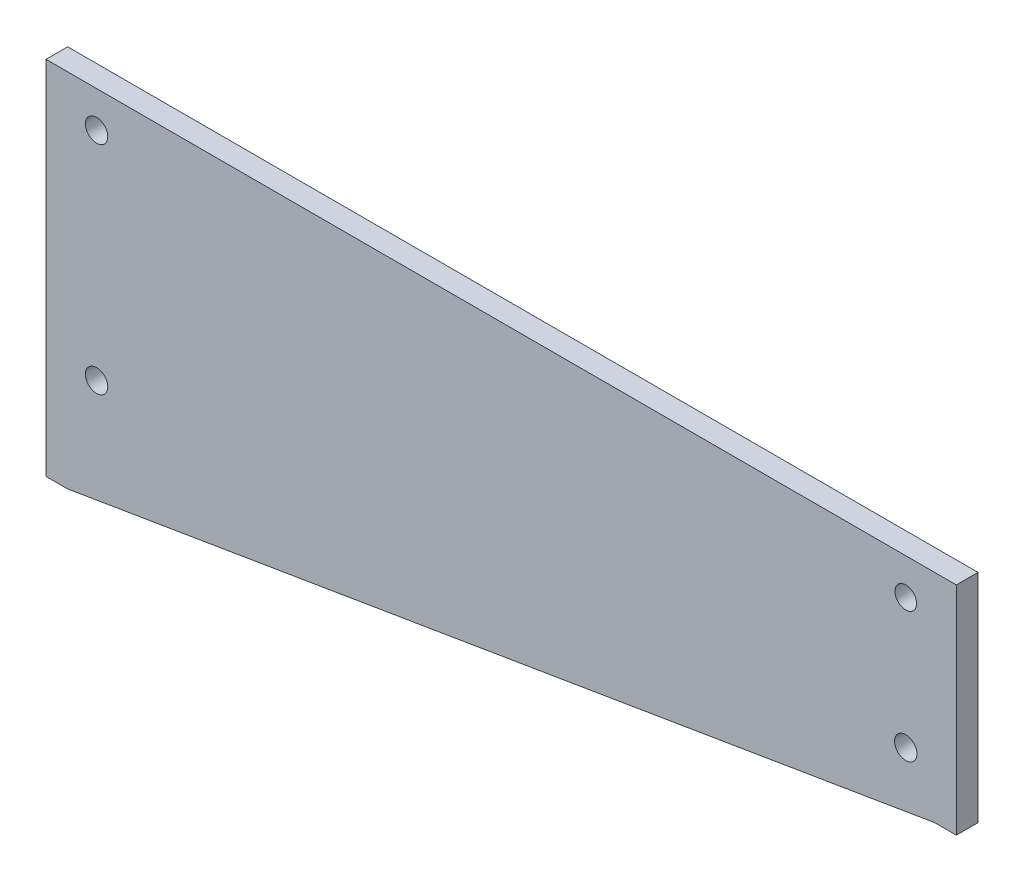
ISO-10303-21;
HEADER;
FILE_DESCRIPTION(('STEP AP214'),'2;1');
FILE_NAME('part.step','',(''),(''),'','','');
FILE_SCHEMA(('AUTOMOTIVE_DESIGN { 1 0 10303 214 1 1 1 1 }'));
ENDSEC;
DATA;
#1=APPLICATION_CONTEXT('core data for automotive mechanical design processes');
#2=APPLICATION_PROTOCOL_DEFINITION('international standard','automotive_design',2000,#1);
#3=PRODUCT_CONTEXT('',#1,'mechanical');
#4=PRODUCT('Part','Part','',(#3));
#5=PRODUCT_RELATED_PRODUCT_CATEGORY('part','',(#4));
#6=PRODUCT_DEFINITION_FORMATION('','',#4);
#7=PRODUCT_DEFINITION_CONTEXT('part definition',#1,'design');
#8=PRODUCT_DEFINITION('design','',#6,#7);
#9=PRODUCT_DEFINITION_SHAPE('','',#8);
#10=(LENGTH_UNIT() NAMED_UNIT(*) SI_UNIT(.MILLI.,.METRE.));
#11=(NAMED_UNIT(*) PLANE_ANGLE_UNIT() SI_UNIT($,.RADIAN.));
#12=(NAMED_UNIT(*) SI_UNIT($,.STERADIAN.) SOLID_ANGLE_UNIT());
#13=UNCERTAINTY_MEASURE_WITH_UNIT(LENGTH_MEASURE(1.E-05),#10,'distance_accuracy_value','');
#14=(GEOMETRIC_REPRESENTATION_CONTEXT(3) GLOBAL_UNCERTAINTY_ASSIGNED_CONTEXT((#13)) GLOBAL_UNIT_ASSIGNED_CONTEXT((#10,
#11,#12)) REPRESENTATION_CONTEXT('',''));
#15=CARTESIAN_POINT('',(0.,0.,0.));
#16=DIRECTION('',(0.,0.,1.));
#17=DIRECTION('',(1.,0.,0.));
#18=AXIS2_PLACEMENT_3D('',#15,#16,#17);
#19=CARTESIAN_POINT('',(-63.,-26.5,3.));
#20=DIRECTION('',(1.,0.,0.));
#21=DIRECTION('',(0.,0.,-1.));
#22=AXIS2_PLACEMENT_3D('',#19,#20,#21);
#23=PLANE('',#22);
#24=DIRECTION('',(0.,-1.,0.));
#25=VECTOR('',#24,1.);
#26=CARTESIAN_POINT('',(-63.,-26.5,0.));
#27=LINE('',#26,#25);
#28=CARTESIAN_POINT('',(-63.,26.5,0.));
#29=VERTEX_POINT('',#28);
#30=CARTESIAN_POINT('',(-63.,-23.5000000000002,0.));
#31=VERTEX_POINT('',#30);
#32=EDGE_CURVE('E94',#29,#31,#27,.T.);
#33=ORIENTED_EDGE('',*,*,#32,.T.);
#34=DIRECTION('',(0.,0.,1.));
#35=VECTOR('',#34,1.);
#36=CARTESIAN_POINT('',(-63.,-23.5000000000002,0.));
#37=LINE('',#36,#35);
#38=CARTESIAN_POINT('',(-63.,-23.5000000000002,3.));
#39=VERTEX_POINT('',#38);
#40=EDGE_CURVE('E167',#31,#39,#37,.T.);
#41=ORIENTED_EDGE('',*,*,#40,.T.);
#42=DIRECTION('',(0.,-1.,0.));
#43=VECTOR('',#42,1.);
#44=CARTESIAN_POINT('',(-63.,-26.5,3.));
#45=LINE('',#44,#43);
#46=CARTESIAN_POINT('',(-63.,26.5,3.));
#47=VERTEX_POINT('',#46);
#48=EDGE_CURVE('E87',#47,#39,#45,.T.);
#49=ORIENTED_EDGE('',*,*,#48,.F.);
#50=DIRECTION('',(0.,0.,-1.));
#51=VECTOR('',#50,1.);
#52=CARTESIAN_POINT('',(-63.,26.5,3.));
#53=LINE('',#52,#51);
#54=EDGE_CURVE('E50',#47,#29,#53,.T.);
#55=ORIENTED_EDGE('',*,*,#54,.T.);
#56=EDGE_LOOP('',(#33,#41,#49,#55));
#57=FACE_BOUND('',#56,.T.);
#58=ADVANCED_FACE('F42',(#57),#23,.F.);
#59=CARTESIAN_POINT('',(63.,-26.5,3.));
#60=DIRECTION('',(-1.,0.,0.));
#61=DIRECTION('',(0.,0.,1.));
#62=AXIS2_PLACEMENT_3D('',#59,#60,#61);
#63=PLANE('',#62);
#64=DIRECTION('',(0.,1.,0.));
#65=VECTOR('',#64,1.);
#66=CARTESIAN_POINT('',(63.,-26.5,3.));
#67=LINE('',#66,#65);
#68=CARTESIAN_POINT('',(63.,-3.50000000000018,3.));
#69=VERTEX_POINT('',#68);
#70=CARTESIAN_POINT('',(63.,26.5,3.));
#71=VERTEX_POINT('',#70);
#72=EDGE_CURVE('E130',#69,#71,#67,.T.);
#73=ORIENTED_EDGE('',*,*,#72,.F.);
#74=DIRECTION('',(0.,0.,1.));
#75=VECTOR('',#74,1.);
#76=CARTESIAN_POINT('',(63.,-3.50000000000018,0.));
#77=LINE('',#76,#75);
#78=CARTESIAN_POINT('',(63.,-3.50000000000018,0.));
#79=VERTEX_POINT('',#78);
#80=EDGE_CURVE('E144',#79,#69,#77,.T.);
#81=ORIENTED_EDGE('',*,*,#80,.F.);
#82=DIRECTION('',(0.,1.,0.));
#83=VECTOR('',#82,1.);
#84=CARTESIAN_POINT('',(63.,-26.5,0.));
#85=LINE('',#84,#83);
#86=CARTESIAN_POINT('',(63.,26.5,0.));
#87=VERTEX_POINT('',#86);
#88=EDGE_CURVE('E88',#79,#87,#85,.T.);
#89=ORIENTED_EDGE('',*,*,#88,.T.);
#90=DIRECTION('',(0.,0.,-1.));
#91=VECTOR('',#90,1.);
#92=CARTESIAN_POINT('',(63.,26.5,3.));
#93=LINE('',#92,#91);
#94=EDGE_CURVE('E11',#71,#87,#93,.T.);
#95=ORIENTED_EDGE('',*,*,#94,.F.);
#96=EDGE_LOOP('',(#73,#81,#89,#95));
#97=FACE_BOUND('',#96,.T.);
#98=ADVANCED_FACE('F142',(#97),#63,.F.);
#99=CARTESIAN_POINT('',(63.,26.5,3.));
#100=DIRECTION('',(0.,-1.,0.));
#101=DIRECTION('',(1.,0.,0.));
#102=AXIS2_PLACEMENT_3D('',#99,#100,#101);
#103=PLANE('',#102);
#104=DIRECTION('',(-1.,0.,0.));
#105=VECTOR('',#104,1.);
#106=CARTESIAN_POINT('',(63.,26.5,0.));
#107=LINE('',#106,#105);
#108=EDGE_CURVE('E79',#87,#29,#107,.T.);
#109=ORIENTED_EDGE('',*,*,#108,.T.);
#110=ORIENTED_EDGE('',*,*,#54,.F.);
#111=DIRECTION('',(-1.,0.,0.));
#112=VECTOR('',#111,1.);
#113=CARTESIAN_POINT('',(63.,26.5,3.));
#114=LINE('',#113,#112);
#115=EDGE_CURVE('E67',#71,#47,#114,.T.);
#116=ORIENTED_EDGE('',*,*,#115,.F.);
#117=ORIENTED_EDGE('',*,*,#94,.T.);
#118=EDGE_LOOP('',(#109,#110,#116,#117));
#119=FACE_BOUND('',#118,.T.);
#120=ADVANCED_FACE('F81',(#119),#103,.F.);
#121=CARTESIAN_POINT('',(0.,0.,3.));
#122=DIRECTION('',(0.,0.,1.));
#123=DIRECTION('',(1.,0.,0.));
#124=AXIS2_PLACEMENT_3D('',#121,#122,#123);
#125=PLANE('',#124);
#126=DIRECTION('',(-1.,-1.08709337827882E-13,0.));
#127=VECTOR('',#126,1.);
#128=CARTESIAN_POINT('',(-60.0000000000001,-23.4999999999999,3.));
#129=LINE('',#128,#127);
#130=CARTESIAN_POINT('',(-60.0000000000001,-23.4999999999999,3.));
#131=VERTEX_POINT('',#130);
#132=EDGE_CURVE('E173',#131,#39,#129,.T.);
#133=ORIENTED_EDGE('',*,*,#132,.F.);
#134=DIRECTION('',(-0.986393923832144,-0.164398987305356,0.));
#135=VECTOR('',#134,1.);
#136=CARTESIAN_POINT('',(-60.0000000000001,-23.4999999999999,3.));
#137=LINE('',#136,#135);
#138=CARTESIAN_POINT('',(60.,-3.5,3.));
#139=VERTEX_POINT('',#138);
#140=EDGE_CURVE('E165',#139,#131,#137,.T.);
#141=ORIENTED_EDGE('',*,*,#140,.F.);
#142=DIRECTION('',(-1.,0.,0.));
#143=VECTOR('',#142,1.);
#144=CARTESIAN_POINT('',(62.98043558182,-3.5,3.));
#145=LINE('',#144,#143);
#146=EDGE_CURVE('E139',#69,#139,#145,.T.);
#147=ORIENTED_EDGE('',*,*,#146,.F.);
#148=ORIENTED_EDGE('',*,*,#72,.T.);
#149=ORIENTED_EDGE('',*,*,#115,.T.);
#150=ORIENTED_EDGE('',*,*,#48,.T.);
#151=EDGE_LOOP('',(#133,#141,#147,#148,#149,#150));
#152=FACE_BOUND('',#151,.T.);
#153=CARTESIAN_POINT('',(56.,3.50000000000001,3.));
#154=DIRECTION('',(0.,0.,1.));
#155=DIRECTION('',(1.,0.,0.));
#156=AXIS2_PLACEMENT_3D('',#153,#154,#155);
#157=CIRCLE('',#156,1.55);
#158=CARTESIAN_POINT('',(57.55,3.50000000000001,3.));
#159=VERTEX_POINT('',#158);
#160=EDGE_CURVE('E122',#159,#159,#157,.T.);
#161=ORIENTED_EDGE('',*,*,#160,.F.);
#162=EDGE_LOOP('',(#161));
#163=FACE_BOUND('',#162,.T.);
#164=CARTESIAN_POINT('',(-56.,-8.49999999999999,3.));
#165=DIRECTION('',(0.,0.,1.));
#166=DIRECTION('',(1.,0.,0.));
#167=AXIS2_PLACEMENT_3D('',#164,#165,#166);
#168=CIRCLE('',#167,1.55);
#169=CARTESIAN_POINT('',(-54.45,-8.49999999999999,3.));
#170=VERTEX_POINT('',#169);
#171=EDGE_CURVE('E111',#170,#170,#168,.T.);
#172=ORIENTED_EDGE('',*,*,#171,.F.);
#173=EDGE_LOOP('',(#172));
#174=FACE_BOUND('',#173,.T.);
#175=CARTESIAN_POINT('',(-56.,21.5,3.));
#176=DIRECTION('',(0.,0.,1.));
#177=DIRECTION('',(1.,0.,0.));
#178=AXIS2_PLACEMENT_3D('',#175,#176,#177);
#179=CIRCLE('',#178,1.54999999999999);
#180=CARTESIAN_POINT('',(-54.45,21.5,3.));
#181=VERTEX_POINT('',#180);
#182=EDGE_CURVE('E100',#181,#181,#179,.T.);
#183=ORIENTED_EDGE('',*,*,#182,.F.);
#184=EDGE_LOOP('',(#183));
#185=FACE_BOUND('',#184,.T.);
#186=CARTESIAN_POINT('',(56.,21.5,3.));
#187=DIRECTION('',(0.,0.,1.));
#188=DIRECTION('',(1.,0.,0.));
#189=AXIS2_PLACEMENT_3D('',#186,#187,#188);
#190=CIRCLE('',#189,1.5);
#191=CARTESIAN_POINT('',(57.5,21.5,3.));
#192=VERTEX_POINT('',#191);
#193=EDGE_CURVE('E104',#192,#192,#190,.T.);
#194=ORIENTED_EDGE('',*,*,#193,.F.);
#195=EDGE_LOOP('',(#194));
#196=FACE_BOUND('',#195,.T.);
#197=ADVANCED_FACE('F134',(#152,#163,#174,#185,#196),#125,.T.);
#198=CARTESIAN_POINT('',(0.,0.,0.));
#199=DIRECTION('',(0.,0.,1.));
#200=DIRECTION('',(1.,0.,0.));
#201=AXIS2_PLACEMENT_3D('',#198,#199,#200);
#202=PLANE('',#201);
#203=CARTESIAN_POINT('',(56.,3.50000000000001,0.));
#204=DIRECTION('',(0.,0.,1.));
#205=DIRECTION('',(1.,0.,0.));
#206=AXIS2_PLACEMENT_3D('',#203,#204,#205);
#207=CIRCLE('',#206,1.55);
#208=CARTESIAN_POINT('',(57.55,3.50000000000001,0.));
#209=VERTEX_POINT('',#208);
#210=EDGE_CURVE('E45',#209,#209,#207,.T.);
#211=ORIENTED_EDGE('',*,*,#210,.T.);
#212=EDGE_LOOP('',(#211));
#213=FACE_BOUND('',#212,.T.);
#214=CARTESIAN_POINT('',(-56.,-8.49999999999999,0.));
#215=DIRECTION('',(0.,0.,1.));
#216=DIRECTION('',(1.,0.,0.));
#217=AXIS2_PLACEMENT_3D('',#214,#215,#216);
#218=CIRCLE('',#217,1.55);
#219=CARTESIAN_POINT('',(-54.45,-8.49999999999999,0.));
#220=VERTEX_POINT('',#219);
#221=EDGE_CURVE('E108',#220,#220,#218,.T.);
#222=ORIENTED_EDGE('',*,*,#221,.T.);
#223=EDGE_LOOP('',(#222));
#224=FACE_BOUND('',#223,.T.);
#225=CARTESIAN_POINT('',(-56.,21.5,0.));
#226=DIRECTION('',(0.,0.,-1.));
#227=DIRECTION('',(-1.,0.,0.));
#228=AXIS2_PLACEMENT_3D('',#225,#226,#227);
#229=CIRCLE('',#228,1.54999999999999);
#230=CARTESIAN_POINT('',(-57.55,21.5,0.));
#231=VERTEX_POINT('',#230);
#232=EDGE_CURVE('E115',#231,#231,#229,.T.);
#233=ORIENTED_EDGE('',*,*,#232,.F.);
#234=EDGE_LOOP('',(#233));
#235=FACE_BOUND('',#234,.T.);
#236=CARTESIAN_POINT('',(56.,21.5,0.));
#237=DIRECTION('',(0.,0.,-1.));
#238=DIRECTION('',(-1.,0.,0.));
#239=AXIS2_PLACEMENT_3D('',#236,#237,#238);
#240=CIRCLE('',#239,1.5);
#241=CARTESIAN_POINT('',(54.5,21.5,0.));
#242=VERTEX_POINT('',#241);
#243=EDGE_CURVE('E110',#242,#242,#240,.T.);
#244=ORIENTED_EDGE('',*,*,#243,.F.);
#245=EDGE_LOOP('',(#244));
#246=FACE_BOUND('',#245,.T.);
#247=DIRECTION('',(-0.986393923832144,-0.164398987305356,0.));
#248=VECTOR('',#247,1.);
#249=CARTESIAN_POINT('',(-60.0000000000001,-23.4999999999999,0.));
#250=LINE('',#249,#248);
#251=CARTESIAN_POINT('',(60.,-3.5,0.));
#252=VERTEX_POINT('',#251);
#253=CARTESIAN_POINT('',(-60.0000000000001,-23.4999999999999,0.));
#254=VERTEX_POINT('',#253);
#255=EDGE_CURVE('E58',#252,#254,#250,.T.);
#256=ORIENTED_EDGE('',*,*,#255,.T.);
#257=DIRECTION('',(-1.,-1.08709337827882E-13,0.));
#258=VECTOR('',#257,1.);
#259=CARTESIAN_POINT('',(-60.0000000000001,-23.4999999999999,0.));
#260=LINE('',#259,#258);
#261=EDGE_CURVE('E99',#254,#31,#260,.T.);
#262=ORIENTED_EDGE('',*,*,#261,.T.);
#263=ORIENTED_EDGE('',*,*,#32,.F.);
#264=ORIENTED_EDGE('',*,*,#108,.F.);
#265=ORIENTED_EDGE('',*,*,#88,.F.);
#266=DIRECTION('',(-1.,9.39873022350376E-12,0.));
#267=VECTOR('',#266,1.);
#268=CARTESIAN_POINT('',(62.98043558182,-3.5,0.));
#269=LINE('',#268,#267);
#270=EDGE_CURVE('E147',#79,#252,#269,.T.);
#271=ORIENTED_EDGE('',*,*,#270,.T.);
#272=EDGE_LOOP('',(#256,#262,#263,#264,#265,#271));
#273=FACE_BOUND('',#272,.T.);
#274=ADVANCED_FACE('F97',(#213,#224,#235,#246,#273),#202,.F.);
#275=CARTESIAN_POINT('',(56.,21.5,10.));
#276=DIRECTION('',(0.,0.,-1.));
#277=DIRECTION('',(-1.,0.,0.));
#278=AXIS2_PLACEMENT_3D('',#275,#276,#277);
#279=CYLINDRICAL_SURFACE('',#278,1.5);
#280=ORIENTED_EDGE('',*,*,#193,.T.);
#281=EDGE_LOOP('',(#280));
#282=FACE_BOUND('',#281,.T.);
#283=ORIENTED_EDGE('',*,*,#243,.T.);
#284=EDGE_LOOP('',(#283));
#285=FACE_BOUND('',#284,.T.);
#286=ADVANCED_FACE('F199',(#282,#285),#279,.F.);
#287=CARTESIAN_POINT('',(-56.,21.5,10.));
#288=DIRECTION('',(0.,0.,-1.));
#289=DIRECTION('',(-1.,0.,0.));
#290=AXIS2_PLACEMENT_3D('',#287,#288,#289);
#291=CYLINDRICAL_SURFACE('',#290,1.54999999999999);
#292=ORIENTED_EDGE('',*,*,#182,.T.);
#293=EDGE_LOOP('',(#292));
#294=FACE_BOUND('',#293,.T.);
#295=ORIENTED_EDGE('',*,*,#232,.T.);
#296=EDGE_LOOP('',(#295));
#297=FACE_BOUND('',#296,.T.);
#298=ADVANCED_FACE('F205',(#294,#297),#291,.F.);
#299=CARTESIAN_POINT('',(-56.,-8.49999999999999,-7.));
#300=DIRECTION('',(0.,0.,1.));
#301=DIRECTION('',(1.,0.,0.));
#302=AXIS2_PLACEMENT_3D('',#299,#300,#301);
#303=CYLINDRICAL_SURFACE('',#302,1.55);
#304=ORIENTED_EDGE('',*,*,#171,.T.);
#305=EDGE_LOOP('',(#304));
#306=FACE_BOUND('',#305,.T.);
#307=ORIENTED_EDGE('',*,*,#221,.F.);
#308=EDGE_LOOP('',(#307));
#309=FACE_BOUND('',#308,.T.);
#310=ADVANCED_FACE('F209',(#306,#309),#303,.F.);
#311=CARTESIAN_POINT('',(56.,3.50000000000001,-7.));
#312=DIRECTION('',(0.,0.,1.));
#313=DIRECTION('',(1.,0.,0.));
#314=AXIS2_PLACEMENT_3D('',#311,#312,#313);
#315=CYLINDRICAL_SURFACE('',#314,1.55);
#316=ORIENTED_EDGE('',*,*,#160,.T.);
#317=EDGE_LOOP('',(#316));
#318=FACE_BOUND('',#317,.T.);
#319=ORIENTED_EDGE('',*,*,#210,.F.);
#320=EDGE_LOOP('',(#319));
#321=FACE_BOUND('',#320,.T.);
#322=ADVANCED_FACE('F212',(#318,#321),#315,.F.);
#323=CARTESIAN_POINT('',(-60.0000000000001,-23.4999999999999,0.));
#324=DIRECTION('',(-1.08709337827882E-13,1.,0.));
#325=DIRECTION('',(-1.,-1.08709337827882E-13,0.));
#326=AXIS2_PLACEMENT_3D('',#323,#324,#325);
#327=PLANE('',#326);
#328=ORIENTED_EDGE('',*,*,#132,.T.);
#329=ORIENTED_EDGE('',*,*,#40,.F.);
#330=ORIENTED_EDGE('',*,*,#261,.F.);
#331=DIRECTION('',(0.,0.,1.));
#332=VECTOR('',#331,1.);
#333=CARTESIAN_POINT('',(-60.0000000000001,-23.4999999999999,0.));
#334=LINE('',#333,#332);
#335=EDGE_CURVE('E163',#254,#131,#334,.T.);
#336=ORIENTED_EDGE('',*,*,#335,.T.);
#337=EDGE_LOOP('',(#328,#329,#330,#336));
#338=FACE_BOUND('',#337,.T.);
#339=ADVANCED_FACE('F170',(#338),#327,.F.);
#340=CARTESIAN_POINT('',(-60.0000000000001,-23.4999999999999,0.));
#341=DIRECTION('',(-0.164398987305356,0.986393923832144,0.));
#342=DIRECTION('',(-0.986393923832144,-0.164398987305356,0.));
#343=AXIS2_PLACEMENT_3D('',#340,#341,#342);
#344=PLANE('',#343);
#345=ORIENTED_EDGE('',*,*,#140,.T.);
#346=ORIENTED_EDGE('',*,*,#335,.F.);
#347=ORIENTED_EDGE('',*,*,#255,.F.);
#348=DIRECTION('',(0.,0.,1.));
#349=VECTOR('',#348,1.);
#350=CARTESIAN_POINT('',(60.,-3.5,0.));
#351=LINE('',#350,#349);
#352=EDGE_CURVE('E168',#252,#139,#351,.T.);
#353=ORIENTED_EDGE('',*,*,#352,.T.);
#354=EDGE_LOOP('',(#345,#346,#347,#353));
#355=FACE_BOUND('',#354,.T.);
#356=ADVANCED_FACE('F164',(#355),#344,.F.);
#357=CARTESIAN_POINT('',(62.98043558182,-3.5,0.));
#358=DIRECTION('',(0.,1.,0.));
#359=DIRECTION('',(0.,0.,1.));
#360=AXIS2_PLACEMENT_3D('',#357,#358,#359);
#361=PLANE('',#360);
#362=ORIENTED_EDGE('',*,*,#146,.T.);
#363=ORIENTED_EDGE('',*,*,#352,.F.);
#364=ORIENTED_EDGE('',*,*,#270,.F.);
#365=ORIENTED_EDGE('',*,*,#80,.T.);
#366=EDGE_LOOP('',(#362,#363,#364,#365));
#367=FACE_BOUND('',#366,.T.);
#368=ADVANCED_FACE('F180',(#367),#361,.F.);
#369=CLOSED_SHELL('',(#58,#98,#120,#197,#274,#286,#298,#310,#322,#339,#356,#368));
#370=MANIFOLD_SOLID_BREP('B2',#369);
#371=ADVANCED_BREP_SHAPE_REPRESENTATION('',(#18,#370),#14);
#372=SHAPE_DEFINITION_REPRESENTATION(#9,#371);
ENDSEC;
END-ISO-10303-21;
